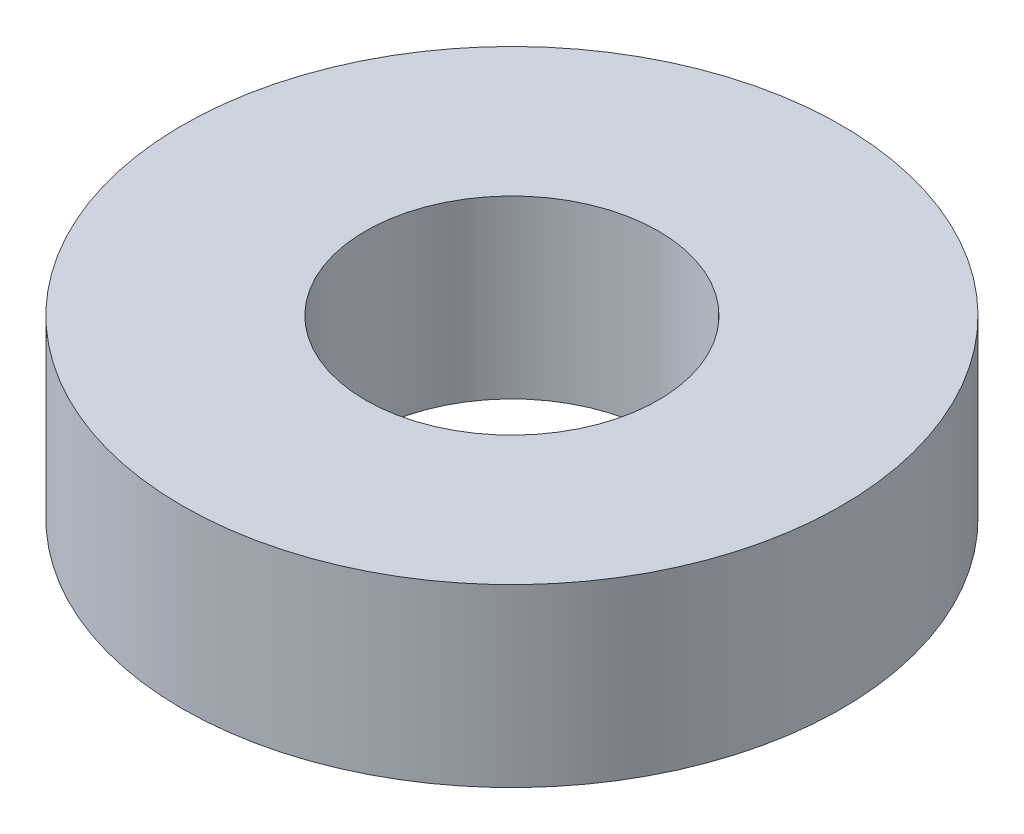
ISO-10303-21;
HEADER;
FILE_DESCRIPTION(('STEP AP214'),'2;1');
FILE_NAME('part.step','',(''),(''),'','','');
FILE_SCHEMA(('AUTOMOTIVE_DESIGN { 1 0 10303 214 1 1 1 1 }'));
ENDSEC;
DATA;
#1=APPLICATION_CONTEXT('core data for automotive mechanical design processes');
#2=APPLICATION_PROTOCOL_DEFINITION('international standard','automotive_design',2000,#1);
#3=PRODUCT_CONTEXT('',#1,'mechanical');
#4=PRODUCT('Part','Part','',(#3));
#5=PRODUCT_RELATED_PRODUCT_CATEGORY('part','',(#4));
#6=PRODUCT_DEFINITION_FORMATION('','',#4);
#7=PRODUCT_DEFINITION_CONTEXT('part definition',#1,'design');
#8=PRODUCT_DEFINITION('design','',#6,#7);
#9=PRODUCT_DEFINITION_SHAPE('','',#8);
#10=(LENGTH_UNIT() NAMED_UNIT(*) SI_UNIT(.MILLI.,.METRE.));
#11=(NAMED_UNIT(*) PLANE_ANGLE_UNIT() SI_UNIT($,.RADIAN.));
#12=(NAMED_UNIT(*) SI_UNIT($,.STERADIAN.) SOLID_ANGLE_UNIT());
#13=UNCERTAINTY_MEASURE_WITH_UNIT(LENGTH_MEASURE(1.E-05),#10,'distance_accuracy_value','');
#14=(GEOMETRIC_REPRESENTATION_CONTEXT(3) GLOBAL_UNCERTAINTY_ASSIGNED_CONTEXT((#13)) GLOBAL_UNIT_ASSIGNED_CONTEXT((#10,
#11,#12)) REPRESENTATION_CONTEXT('',''));
#15=CARTESIAN_POINT('',(0.,0.,0.));
#16=DIRECTION('',(0.,0.,1.));
#17=DIRECTION('',(1.,0.,0.));
#18=AXIS2_PLACEMENT_3D('',#15,#16,#17);
#19=CARTESIAN_POINT('',(0.,12.,0.));
#20=DIRECTION('',(0.,1.,0.));
#21=DIRECTION('',(0.,0.,1.));
#22=AXIS2_PLACEMENT_3D('',#19,#20,#21);
#23=PLANE('',#22);
#24=CARTESIAN_POINT('',(0.,12.,0.));
#25=DIRECTION('',(0.,1.,0.));
#26=DIRECTION('',(0.,0.,1.));
#27=AXIS2_PLACEMENT_3D('',#24,#25,#26);
#28=CIRCLE('',#27,22.5);
#29=CARTESIAN_POINT('',(0.,12.,22.5));
#30=VERTEX_POINT('',#29);
#31=EDGE_CURVE('E10',#30,#30,#28,.T.);
#32=ORIENTED_EDGE('',*,*,#31,.T.);
#33=EDGE_LOOP('',(#32));
#34=FACE_BOUND('',#33,.T.);
#35=CARTESIAN_POINT('',(0.,12.,0.));
#36=DIRECTION('',(0.,1.,0.));
#37=DIRECTION('',(0.,0.,1.));
#38=AXIS2_PLACEMENT_3D('',#35,#36,#37);
#39=CIRCLE('',#38,10.);
#40=CARTESIAN_POINT('',(0.,12.,10.));
#41=VERTEX_POINT('',#40);
#42=EDGE_CURVE('E44',#41,#41,#39,.T.);
#43=ORIENTED_EDGE('',*,*,#42,.F.);
#44=EDGE_LOOP('',(#43));
#45=FACE_BOUND('',#44,.T.);
#46=ADVANCED_FACE('F33',(#34,#45),#23,.T.);
#47=CARTESIAN_POINT('',(0.,0.,0.));
#48=DIRECTION('',(0.,1.,0.));
#49=DIRECTION('',(0.,0.,1.));
#50=AXIS2_PLACEMENT_3D('',#47,#48,#49);
#51=PLANE('',#50);
#52=CARTESIAN_POINT('',(0.,0.,0.));
#53=DIRECTION('',(0.,1.,0.));
#54=DIRECTION('',(0.,0.,1.));
#55=AXIS2_PLACEMENT_3D('',#52,#53,#54);
#56=CIRCLE('',#55,22.5);
#57=CARTESIAN_POINT('',(0.,0.,22.5));
#58=VERTEX_POINT('',#57);
#59=EDGE_CURVE('E37',#58,#58,#56,.T.);
#60=ORIENTED_EDGE('',*,*,#59,.F.);
#61=EDGE_LOOP('',(#60));
#62=FACE_BOUND('',#61,.T.);
#63=CARTESIAN_POINT('',(0.,0.,0.));
#64=DIRECTION('',(0.,1.,0.));
#65=DIRECTION('',(0.,0.,1.));
#66=AXIS2_PLACEMENT_3D('',#63,#64,#65);
#67=CIRCLE('',#66,10.);
#68=CARTESIAN_POINT('',(0.,0.,10.));
#69=VERTEX_POINT('',#68);
#70=EDGE_CURVE('E46',#69,#69,#67,.T.);
#71=ORIENTED_EDGE('',*,*,#70,.T.);
#72=EDGE_LOOP('',(#71));
#73=FACE_BOUND('',#72,.T.);
#74=ADVANCED_FACE('F56',(#62,#73),#51,.F.);
#75=CARTESIAN_POINT('',(0.,12.,0.));
#76=DIRECTION('',(0.,-1.,0.));
#77=DIRECTION('',(0.,0.,-1.));
#78=AXIS2_PLACEMENT_3D('',#75,#76,#77);
#79=CYLINDRICAL_SURFACE('',#78,22.5);
#80=ORIENTED_EDGE('',*,*,#31,.F.);
#81=EDGE_LOOP('',(#80));
#82=FACE_BOUND('',#81,.T.);
#83=ORIENTED_EDGE('',*,*,#59,.T.);
#84=EDGE_LOOP('',(#83));
#85=FACE_BOUND('',#84,.T.);
#86=ADVANCED_FACE('F35',(#82,#85),#79,.T.);
#87=CARTESIAN_POINT('',(0.,12.,0.));
#88=DIRECTION('',(0.,-1.,0.));
#89=DIRECTION('',(0.,0.,-1.));
#90=AXIS2_PLACEMENT_3D('',#87,#88,#89);
#91=CYLINDRICAL_SURFACE('',#90,10.);
#92=ORIENTED_EDGE('',*,*,#42,.T.);
#93=EDGE_LOOP('',(#92));
#94=FACE_BOUND('',#93,.T.);
#95=ORIENTED_EDGE('',*,*,#70,.F.);
#96=EDGE_LOOP('',(#95));
#97=FACE_BOUND('',#96,.T.);
#98=ADVANCED_FACE('F52',(#94,#97),#91,.F.);
#99=CLOSED_SHELL('',(#46,#74,#86,#98));
#100=MANIFOLD_SOLID_BREP('B2',#99);
#101=ADVANCED_BREP_SHAPE_REPRESENTATION('',(#18,#100),#14);
#102=SHAPE_DEFINITION_REPRESENTATION(#9,#101);
ENDSEC;
END-ISO-10303-21;
